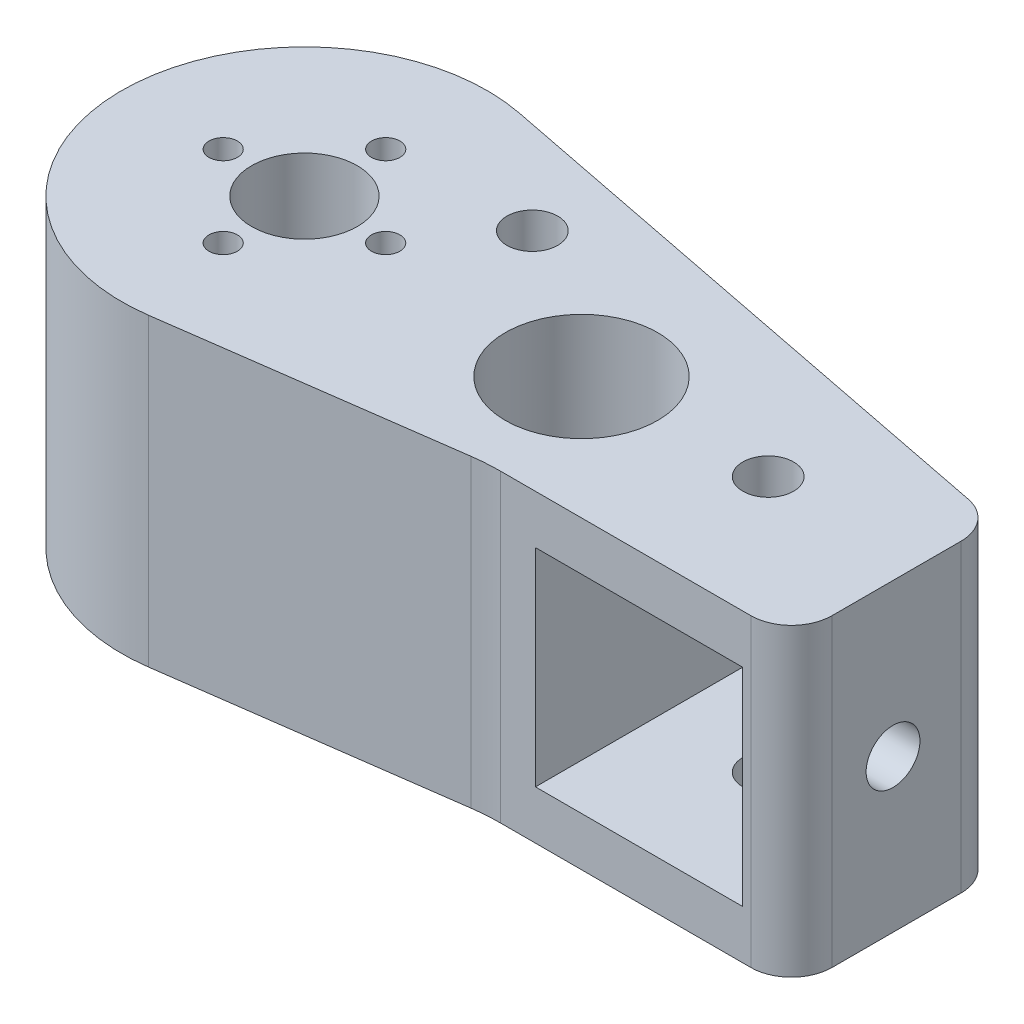
ISO-10303-21;
HEADER;
FILE_DESCRIPTION(('STEP AP214'),'2;1');
FILE_NAME('part.step','',(''),(''),'','','');
FILE_SCHEMA(('AUTOMOTIVE_DESIGN { 1 0 10303 214 1 1 1 1 }'));
ENDSEC;
DATA;
#1=APPLICATION_CONTEXT('core data for automotive mechanical design processes');
#2=APPLICATION_PROTOCOL_DEFINITION('international standard','automotive_design',2000,#1);
#3=PRODUCT_CONTEXT('',#1,'mechanical');
#4=PRODUCT('Part','Part','',(#3));
#5=PRODUCT_RELATED_PRODUCT_CATEGORY('part','',(#4));
#6=PRODUCT_DEFINITION_FORMATION('','',#4);
#7=PRODUCT_DEFINITION_CONTEXT('part definition',#1,'design');
#8=PRODUCT_DEFINITION('design','',#6,#7);
#9=PRODUCT_DEFINITION_SHAPE('','',#8);
#10=(LENGTH_UNIT() NAMED_UNIT(*) SI_UNIT(.MILLI.,.METRE.));
#11=(NAMED_UNIT(*) PLANE_ANGLE_UNIT() SI_UNIT($,.RADIAN.));
#12=(NAMED_UNIT(*) SI_UNIT($,.STERADIAN.) SOLID_ANGLE_UNIT());
#13=UNCERTAINTY_MEASURE_WITH_UNIT(LENGTH_MEASURE(1.E-05),#10,'distance_accuracy_value','');
#14=(GEOMETRIC_REPRESENTATION_CONTEXT(3) GLOBAL_UNCERTAINTY_ASSIGNED_CONTEXT((#13)) GLOBAL_UNIT_ASSIGNED_CONTEXT((#10,
#11,#12)) REPRESENTATION_CONTEXT('',''));
#15=CARTESIAN_POINT('',(0.,0.,0.));
#16=DIRECTION('',(0.,0.,1.));
#17=DIRECTION('',(1.,0.,0.));
#18=AXIS2_PLACEMENT_3D('',#15,#16,#17);
#19=CARTESIAN_POINT('',(2.45142583217951,0.,-12.4673890264279));
#20=DIRECTION('',(-0.192932807900445,0.,0.981211970797161));
#21=DIRECTION('',(0.981211970797162,0.,0.192932807900445));
#22=AXIS2_PLACEMENT_3D('',#19,#20,#21);
#23=PLANE('',#22);
#24=DIRECTION('',(0.981211970797162,0.,0.192932807900445));
#25=VECTOR('',#24,1.);
#26=CARTESIAN_POINT('',(2.45142583217951,30.,-12.4673890264279));
#27=LINE('',#26,#25);
#28=CARTESIAN_POINT('',(-43.2662184669635,30.,-21.4567142158276));
#29=VERTEX_POINT('',#28);
#30=CARTESIAN_POINT('',(11.7717312316018,30.,-10.6347649403812));
#31=VERTEX_POINT('',#30);
#32=EDGE_CURVE('E281',#29,#31,#27,.T.);
#33=ORIENTED_EDGE('',*,*,#32,.T.);
#34=DIRECTION('',(0.,-1.,0.));
#35=VECTOR('',#34,1.);
#36=CARTESIAN_POINT('',(11.7717312316018,0.,-10.6347649403812));
#37=LINE('',#36,#35);
#38=CARTESIAN_POINT('',(11.7717312316018,0.,-10.6347649403812));
#39=VERTEX_POINT('',#38);
#40=EDGE_CURVE('E346',#31,#39,#37,.T.);
#41=ORIENTED_EDGE('',*,*,#40,.T.);
#42=DIRECTION('',(0.981211970797162,0.,0.192932807900445));
#43=VECTOR('',#42,1.);
#44=CARTESIAN_POINT('',(2.45142583217951,0.,-12.4673890264279));
#45=LINE('',#44,#43);
#46=CARTESIAN_POINT('',(-43.2662184669635,0.,-21.4567142158276));
#47=VERTEX_POINT('',#46);
#48=EDGE_CURVE('E254',#47,#39,#45,.T.);
#49=ORIENTED_EDGE('',*,*,#48,.F.);
#50=DIRECTION('',(0.,1.,0.));
#51=VECTOR('',#50,1.);
#52=CARTESIAN_POINT('',(-43.2662184669635,0.,-21.4567142158276));
#53=LINE('',#52,#51);
#54=EDGE_CURVE('E278',#47,#29,#53,.T.);
#55=ORIENTED_EDGE('',*,*,#54,.T.);
#56=EDGE_LOOP('',(#33,#41,#49,#55));
#57=FACE_BOUND('',#56,.T.);
#58=DIRECTION('',(0.981211970797162,0.,0.192932807900445));
#59=VECTOR('',#58,1.);
#60=CARTESIAN_POINT('',(2.45142583217951,4.8,-12.4673890264279));
#61=LINE('',#60,#59);
#62=CARTESIAN_POINT('',(-10.2,4.8,-14.9550014714367));
#63=VERTEX_POINT('',#62);
#64=CARTESIAN_POINT('',(10.2,4.8,-10.9438098040832));
#65=VERTEX_POINT('',#64);
#66=EDGE_CURVE('E321',#63,#65,#61,.T.);
#67=ORIENTED_EDGE('',*,*,#66,.T.);
#68=DIRECTION('',(0.,1.,0.));
#69=VECTOR('',#68,1.);
#70=CARTESIAN_POINT('',(10.2,0.,-10.9438098040832));
#71=LINE('',#70,#69);
#72=CARTESIAN_POINT('',(10.2,25.2,-10.9438098040832));
#73=VERTEX_POINT('',#72);
#74=EDGE_CURVE('E324',#65,#73,#71,.T.);
#75=ORIENTED_EDGE('',*,*,#74,.T.);
#76=DIRECTION('',(-0.981211970797162,0.,-0.192932807900445));
#77=VECTOR('',#76,1.);
#78=CARTESIAN_POINT('',(2.45142583217951,25.2,-12.4673890264279));
#79=LINE('',#78,#77);
#80=CARTESIAN_POINT('',(-10.2,25.2,-14.9550014714367));
#81=VERTEX_POINT('',#80);
#82=EDGE_CURVE('E313',#73,#81,#79,.T.);
#83=ORIENTED_EDGE('',*,*,#82,.T.);
#84=DIRECTION('',(0.,-1.,0.));
#85=VECTOR('',#84,1.);
#86=CARTESIAN_POINT('',(-10.2,0.,-14.9550014714367));
#87=LINE('',#86,#85);
#88=EDGE_CURVE('E318',#81,#63,#87,.T.);
#89=ORIENTED_EDGE('',*,*,#88,.T.);
#90=EDGE_LOOP('',(#67,#75,#83,#89));
#91=FACE_BOUND('',#90,.T.);
#92=DIRECTION('',(-0.981211970797162,0.,-0.192932807900445));
#93=VECTOR('',#92,1.);
#94=CARTESIAN_POINT('',(2.45142583217951,14.,-12.4673890264279));
#95=LINE('',#94,#93);
#96=CARTESIAN_POINT('',(-26.4156936034125,14.,-18.1434453470428));
#97=VERTEX_POINT('',#96);
#98=CARTESIAN_POINT('',(-40.7928434485683,14.,-20.9703818009243));
#99=VERTEX_POINT('',#98);
#100=EDGE_CURVE('E169',#97,#99,#95,.T.);
#101=ORIENTED_EDGE('',*,*,#100,.F.);
#102=DIRECTION('',(0.,1.,0.));
#103=VECTOR('',#102,1.);
#104=CARTESIAN_POINT('',(-26.4156936034125,0.,-18.1434453470428));
#105=LINE('',#104,#103);
#106=CARTESIAN_POINT('',(-26.4156936034125,20.,-18.1434453470428));
#107=VERTEX_POINT('',#106);
#108=EDGE_CURVE('E334',#97,#107,#105,.T.);
#109=ORIENTED_EDGE('',*,*,#108,.T.);
#110=DIRECTION('',(-0.981211970797162,0.,-0.192932807900445));
#111=VECTOR('',#110,1.);
#112=CARTESIAN_POINT('',(2.45142583217951,20.,-12.4673890264279));
#113=LINE('',#112,#111);
#114=CARTESIAN_POINT('',(-40.7928434485683,20.,-20.9703818009243));
#115=VERTEX_POINT('',#114);
#116=EDGE_CURVE('E206',#107,#115,#113,.T.);
#117=ORIENTED_EDGE('',*,*,#116,.T.);
#118=DIRECTION('',(0.,-1.,0.));
#119=VECTOR('',#118,1.);
#120=CARTESIAN_POINT('',(-40.7928434485683,0.,-20.9703818009243));
#121=LINE('',#120,#119);
#122=EDGE_CURVE('E330',#115,#99,#121,.T.);
#123=ORIENTED_EDGE('',*,*,#122,.T.);
#124=EDGE_LOOP('',(#101,#109,#117,#123));
#125=FACE_BOUND('',#124,.T.);
#126=ADVANCED_FACE('F39',(#57,#91,#125),#23,.F.);
#127=CARTESIAN_POINT('',(-32.5711244596008,0.,-12.0623972205181));
#128=DIRECTION('',(0.,1.,0.));
#129=DIRECTION('',(0.,0.,1.));
#130=AXIS2_PLACEMENT_3D('',#127,#128,#129);
#131=CYLINDRICAL_SURFACE('',#130,2.5);
#132=CARTESIAN_POINT('',(-32.5711244596008,0.,-12.0623972205181));
#133=DIRECTION('',(0.,1.,0.));
#134=DIRECTION('',(0.,0.,1.));
#135=AXIS2_PLACEMENT_3D('',#132,#133,#134);
#136=CIRCLE('',#135,2.5);
#137=CARTESIAN_POINT('',(-32.5711244596008,0.,-9.56239722051805));
#138=VERTEX_POINT('',#137);
#139=EDGE_CURVE('E212',#138,#138,#136,.T.);
#140=ORIENTED_EDGE('',*,*,#139,.F.);
#141=EDGE_LOOP('',(#140));
#142=FACE_BOUND('',#141,.T.);
#143=CARTESIAN_POINT('',(-32.5711244596008,14.,-12.0623972205181));
#144=DIRECTION('',(0.,1.,0.));
#145=DIRECTION('',(0.,0.,1.));
#146=AXIS2_PLACEMENT_3D('',#143,#144,#145);
#147=CIRCLE('',#146,2.5);
#148=CARTESIAN_POINT('',(-32.5711244596008,14.,-9.56239722051805));
#149=VERTEX_POINT('',#148);
#150=EDGE_CURVE('E203',#149,#149,#147,.F.);
#151=ORIENTED_EDGE('',*,*,#150,.F.);
#152=EDGE_LOOP('',(#151));
#153=FACE_BOUND('',#152,.T.);
#154=ADVANCED_FACE('F409',(#142,#153),#131,.F.);
#155=CARTESIAN_POINT('',(-17.7223485107761,0.,-2.05322899067661));
#156=DIRECTION('',(0.,1.,0.));
#157=DIRECTION('',(0.,0.,1.));
#158=AXIS2_PLACEMENT_3D('',#155,#156,#157);
#159=CYLINDRICAL_SURFACE('',#158,7.5);
#160=CARTESIAN_POINT('',(-17.7223485107761,30.,-2.05322899067661));
#161=DIRECTION('',(0.,1.,0.));
#162=DIRECTION('',(0.,0.,1.));
#163=AXIS2_PLACEMENT_3D('',#160,#161,#162);
#164=CIRCLE('',#163,7.5);
#165=CARTESIAN_POINT('',(-17.7223485107761,30.,5.44677100932339));
#166=VERTEX_POINT('',#165);
#167=EDGE_CURVE('E247',#166,#166,#164,.T.);
#168=ORIENTED_EDGE('',*,*,#167,.T.);
#169=EDGE_LOOP('',(#168));
#170=FACE_BOUND('',#169,.T.);
#171=CARTESIAN_POINT('',(-17.7223485107761,4.,-2.05322899067661));
#172=DIRECTION('',(0.,-1.,0.));
#173=DIRECTION('',(0.,0.,-1.));
#174=AXIS2_PLACEMENT_3D('',#171,#172,#173);
#175=CIRCLE('',#174,7.5);
#176=CARTESIAN_POINT('',(-17.7223485107761,4.,-9.55322899067661));
#177=VERTEX_POINT('',#176);
#178=EDGE_CURVE('E327',#177,#177,#175,.F.);
#179=ORIENTED_EDGE('',*,*,#178,.F.);
#180=EDGE_LOOP('',(#179));
#181=FACE_BOUND('',#180,.T.);
#182=ADVANCED_FACE('F413',(#170,#181),#159,.F.);
#183=CARTESIAN_POINT('',(15.,30.,-10.));
#184=DIRECTION('',(-1.,0.,0.));
#185=DIRECTION('',(0.,0.,1.));
#186=AXIS2_PLACEMENT_3D('',#183,#184,#185);
#187=PLANE('',#186);
#188=CARTESIAN_POINT('',(15.,15.,0.));
#189=DIRECTION('',(1.,0.,0.));
#190=DIRECTION('',(0.,0.,-1.));
#191=AXIS2_PLACEMENT_3D('',#188,#189,#190);
#192=CIRCLE('',#191,2.65);
#193=CARTESIAN_POINT('',(15.,15.,-2.65));
#194=VERTEX_POINT('',#193);
#195=EDGE_CURVE('E349',#194,#194,#192,.T.);
#196=ORIENTED_EDGE('',*,*,#195,.F.);
#197=EDGE_LOOP('',(#196));
#198=FACE_BOUND('',#197,.T.);
#199=DIRECTION('',(0.,0.,-1.));
#200=VECTOR('',#199,1.);
#201=CARTESIAN_POINT('',(15.,0.,-10.));
#202=LINE('',#201,#200);
#203=CARTESIAN_POINT('',(15.,0.,6.));
#204=VERTEX_POINT('',#203);
#205=CARTESIAN_POINT('',(15.,0.,-6.70991705719255));
#206=VERTEX_POINT('',#205);
#207=EDGE_CURVE('E306',#204,#206,#202,.T.);
#208=ORIENTED_EDGE('',*,*,#207,.T.);
#209=DIRECTION('',(0.,-1.,0.));
#210=VECTOR('',#209,1.);
#211=CARTESIAN_POINT('',(15.,30.,-6.70991705719255));
#212=LINE('',#211,#210);
#213=CARTESIAN_POINT('',(15.,30.,-6.70991705719255));
#214=VERTEX_POINT('',#213);
#215=EDGE_CURVE('E60',#206,#214,#212,.F.);
#216=ORIENTED_EDGE('',*,*,#215,.T.);
#217=DIRECTION('',(0.,0.,-1.));
#218=VECTOR('',#217,1.);
#219=CARTESIAN_POINT('',(15.,30.,-10.));
#220=LINE('',#219,#218);
#221=CARTESIAN_POINT('',(15.,30.,6.));
#222=VERTEX_POINT('',#221);
#223=EDGE_CURVE('E308',#222,#214,#220,.T.);
#224=ORIENTED_EDGE('',*,*,#223,.F.);
#225=DIRECTION('',(0.,-1.,0.));
#226=VECTOR('',#225,1.);
#227=CARTESIAN_POINT('',(15.,30.,6.));
#228=LINE('',#227,#226);
#229=EDGE_CURVE('E356',#222,#204,#228,.T.);
#230=ORIENTED_EDGE('',*,*,#229,.T.);
#231=EDGE_LOOP('',(#208,#216,#224,#230));
#232=FACE_BOUND('',#231,.T.);
#233=ADVANCED_FACE('F378',(#198,#232),#187,.F.);
#234=CARTESIAN_POINT('',(-15.,30.,10.));
#235=DIRECTION('',(0.,0.,-1.));
#236=DIRECTION('',(-1.,0.,0.));
#237=AXIS2_PLACEMENT_3D('',#234,#235,#236);
#238=PLANE('',#237);
#239=DIRECTION('',(-1.,0.,0.));
#240=VECTOR('',#239,1.);
#241=CARTESIAN_POINT('',(-10.2,25.2,10.));
#242=LINE('',#241,#240);
#243=CARTESIAN_POINT('',(10.2,25.2,10.));
#244=VERTEX_POINT('',#243);
#245=CARTESIAN_POINT('',(-10.2,25.2,10.));
#246=VERTEX_POINT('',#245);
#247=EDGE_CURVE('E235',#244,#246,#242,.T.);
#248=ORIENTED_EDGE('',*,*,#247,.F.);
#249=DIRECTION('',(0.,1.,0.));
#250=VECTOR('',#249,1.);
#251=CARTESIAN_POINT('',(10.2,4.8,10.));
#252=LINE('',#251,#250);
#253=CARTESIAN_POINT('',(10.2,4.8,10.));
#254=VERTEX_POINT('',#253);
#255=EDGE_CURVE('E231',#254,#244,#252,.T.);
#256=ORIENTED_EDGE('',*,*,#255,.F.);
#257=DIRECTION('',(1.,0.,0.));
#258=VECTOR('',#257,1.);
#259=CARTESIAN_POINT('',(-10.2,4.8,10.));
#260=LINE('',#259,#258);
#261=CARTESIAN_POINT('',(-10.2,4.8,10.));
#262=VERTEX_POINT('',#261);
#263=EDGE_CURVE('E241',#262,#254,#260,.T.);
#264=ORIENTED_EDGE('',*,*,#263,.F.);
#265=DIRECTION('',(0.,-1.,0.));
#266=VECTOR('',#265,1.);
#267=CARTESIAN_POINT('',(-10.2,4.8,10.));
#268=LINE('',#267,#266);
#269=EDGE_CURVE('E238',#246,#262,#268,.T.);
#270=ORIENTED_EDGE('',*,*,#269,.F.);
#271=EDGE_LOOP('',(#248,#256,#264,#270));
#272=FACE_BOUND('',#271,.T.);
#273=DIRECTION('',(1.,0.,0.));
#274=VECTOR('',#273,1.);
#275=CARTESIAN_POINT('',(-15.,0.,10.));
#276=LINE('',#275,#274);
#277=CARTESIAN_POINT('',(-13.6279544134037,0.,10.));
#278=VERTEX_POINT('',#277);
#279=CARTESIAN_POINT('',(11.,0.,10.));
#280=VERTEX_POINT('',#279);
#281=EDGE_CURVE('E311',#278,#280,#276,.T.);
#282=ORIENTED_EDGE('',*,*,#281,.T.);
#283=DIRECTION('',(0.,-1.,0.));
#284=VECTOR('',#283,1.);
#285=CARTESIAN_POINT('',(11.,30.,10.));
#286=LINE('',#285,#284);
#287=CARTESIAN_POINT('',(11.,30.,10.));
#288=VERTEX_POINT('',#287);
#289=EDGE_CURVE('E11',#280,#288,#286,.F.);
#290=ORIENTED_EDGE('',*,*,#289,.T.);
#291=DIRECTION('',(1.,0.,0.));
#292=VECTOR('',#291,1.);
#293=CARTESIAN_POINT('',(-15.,30.,10.));
#294=LINE('',#293,#292);
#295=CARTESIAN_POINT('',(-13.6279544134037,30.,10.));
#296=VERTEX_POINT('',#295);
#297=EDGE_CURVE('E310',#296,#288,#294,.T.);
#298=ORIENTED_EDGE('',*,*,#297,.F.);
#299=DIRECTION('',(0.,-1.,0.));
#300=VECTOR('',#299,1.);
#301=CARTESIAN_POINT('',(-13.6279544134037,0.,10.));
#302=LINE('',#301,#300);
#303=EDGE_CURVE('E337',#296,#278,#302,.T.);
#304=ORIENTED_EDGE('',*,*,#303,.T.);
#305=EDGE_LOOP('',(#282,#290,#298,#304));
#306=FACE_BOUND('',#305,.T.);
#307=ADVANCED_FACE('F383',(#272,#306),#238,.F.);
#308=CARTESIAN_POINT('',(0.,30.,0.));
#309=DIRECTION('',(0.,1.,0.));
#310=DIRECTION('',(0.,0.,1.));
#311=AXIS2_PLACEMENT_3D('',#308,#309,#310);
#312=PLANE('',#311);
#313=CARTESIAN_POINT('',(-32.5711244596008,30.,-12.0623972205181));
#314=DIRECTION('',(0.,1.,0.));
#315=DIRECTION('',(0.,0.,1.));
#316=AXIS2_PLACEMENT_3D('',#313,#314,#315);
#317=CIRCLE('',#316,2.5);
#318=CARTESIAN_POINT('',(-32.5711244596008,30.,-9.56239722051805));
#319=VERTEX_POINT('',#318);
#320=EDGE_CURVE('E216',#319,#319,#317,.T.);
#321=ORIENTED_EDGE('',*,*,#320,.F.);
#322=EDGE_LOOP('',(#321));
#323=FACE_BOUND('',#322,.T.);
#324=CARTESIAN_POINT('',(0.,30.,-2.71109291847438));
#325=DIRECTION('',(0.,1.,0.));
#326=DIRECTION('',(0.,0.,1.));
#327=AXIS2_PLACEMENT_3D('',#324,#325,#326);
#328=CIRCLE('',#327,2.5);
#329=CARTESIAN_POINT('',(0.,30.,-0.211092918474376));
#330=VERTEX_POINT('',#329);
#331=EDGE_CURVE('E211',#330,#330,#328,.T.);
#332=ORIENTED_EDGE('',*,*,#331,.F.);
#333=EDGE_LOOP('',(#332));
#334=FACE_BOUND('',#333,.T.);
#335=ORIENTED_EDGE('',*,*,#167,.F.);
#336=EDGE_LOOP('',(#335));
#337=FACE_BOUND('',#336,.T.);
#338=ORIENTED_EDGE('',*,*,#223,.T.);
#339=CARTESIAN_POINT('',(11.,30.,-6.70991705719255));
#340=DIRECTION('',(0.,1.,0.));
#341=DIRECTION('',(0.,0.,1.));
#342=AXIS2_PLACEMENT_3D('',#339,#340,#341);
#343=CIRCLE('',#342,4.);
#344=EDGE_CURVE('E47',#214,#31,#343,.T.);
#345=ORIENTED_EDGE('',*,*,#344,.T.);
#346=ORIENTED_EDGE('',*,*,#32,.F.);
#347=CARTESIAN_POINT('',(-46.7390090091715,30.,-3.79489874147867));
#348=DIRECTION('',(0.,1.,0.));
#349=DIRECTION('',(0.,0.,1.));
#350=AXIS2_PLACEMENT_3D('',#347,#348,#349);
#351=CIRCLE('',#350,18.);
#352=CARTESIAN_POINT('',(-44.2808955058442,30.,14.0364690693417));
#353=VERTEX_POINT('',#352);
#354=EDGE_CURVE('E284',#29,#353,#351,.T.);
#355=ORIENTED_EDGE('',*,*,#354,.T.);
#356=DIRECTION('',(-0.990631545045575,0.,0.136561861295961));
#357=VECTOR('',#356,1.);
#358=CARTESIAN_POINT('',(1.07308774708991,30.,7.78427126564508));
#359=LINE('',#358,#357);
#360=CARTESIAN_POINT('',(-16.3591916393229,30.,10.1873690990885));
#361=VERTEX_POINT('',#360);
#362=EDGE_CURVE('E287',#361,#353,#359,.T.);
#363=ORIENTED_EDGE('',*,*,#362,.F.);
#364=CARTESIAN_POINT('',(-13.6279544134037,30.,30.));
#365=DIRECTION('',(0.,1.,0.));
#366=DIRECTION('',(0.,0.,1.));
#367=AXIS2_PLACEMENT_3D('',#364,#365,#366);
#368=CIRCLE('',#367,20.);
#369=EDGE_CURVE('E344',#361,#296,#368,.F.);
#370=ORIENTED_EDGE('',*,*,#369,.T.);
#371=ORIENTED_EDGE('',*,*,#297,.T.);
#372=CARTESIAN_POINT('',(11.,30.,6.));
#373=DIRECTION('',(0.,1.,0.));
#374=DIRECTION('',(0.,0.,1.));
#375=AXIS2_PLACEMENT_3D('',#372,#373,#374);
#376=CIRCLE('',#375,4.);
#377=EDGE_CURVE('E360',#288,#222,#376,.T.);
#378=ORIENTED_EDGE('',*,*,#377,.T.);
#379=EDGE_LOOP('',(#338,#345,#346,#355,#363,#370,#371,#378));
#380=FACE_BOUND('',#379,.T.);
#381=CARTESIAN_POINT('',(-46.7390090091715,30.,-3.79489874147867));
#382=DIRECTION('',(0.,1.,0.));
#383=DIRECTION('',(0.,0.,1.));
#384=AXIS2_PLACEMENT_3D('',#381,#382,#383);
#385=CIRCLE('',#384,5.2);
#386=CARTESIAN_POINT('',(-46.7390090091715,30.,1.40510125852133));
#387=VERTEX_POINT('',#386);
#388=EDGE_CURVE('E289',#387,#387,#385,.T.);
#389=ORIENTED_EDGE('',*,*,#388,.F.);
#390=EDGE_LOOP('',(#389));
#391=FACE_BOUND('',#390,.T.);
#392=CARTESIAN_POINT('',(-46.7390090091715,30.,4.20510125852133));
#393=DIRECTION('',(0.,1.,0.));
#394=DIRECTION('',(0.,0.,1.));
#395=AXIS2_PLACEMENT_3D('',#392,#393,#394);
#396=CIRCLE('',#395,1.4);
#397=CARTESIAN_POINT('',(-46.7390090091715,30.,5.60510125852133));
#398=VERTEX_POINT('',#397);
#399=EDGE_CURVE('E292',#398,#398,#396,.T.);
#400=ORIENTED_EDGE('',*,*,#399,.F.);
#401=EDGE_LOOP('',(#400));
#402=FACE_BOUND('',#401,.T.);
#403=CARTESIAN_POINT('',(-54.7390090091715,30.,-3.79489874147867));
#404=DIRECTION('',(0.,1.,0.));
#405=DIRECTION('',(0.,0.,1.));
#406=AXIS2_PLACEMENT_3D('',#403,#404,#405);
#407=CIRCLE('',#406,1.4);
#408=CARTESIAN_POINT('',(-54.7390090091715,30.,-2.39489874147867));
#409=VERTEX_POINT('',#408);
#410=EDGE_CURVE('E295',#409,#409,#407,.T.);
#411=ORIENTED_EDGE('',*,*,#410,.F.);
#412=EDGE_LOOP('',(#411));
#413=FACE_BOUND('',#412,.T.);
#414=CARTESIAN_POINT('',(-46.7390090091715,30.,-11.7948987414787));
#415=DIRECTION('',(0.,1.,0.));
#416=DIRECTION('',(0.,0.,1.));
#417=AXIS2_PLACEMENT_3D('',#414,#415,#416);
#418=CIRCLE('',#417,1.4);
#419=CARTESIAN_POINT('',(-46.7390090091715,30.,-10.3948987414787));
#420=VERTEX_POINT('',#419);
#421=EDGE_CURVE('E298',#420,#420,#418,.T.);
#422=ORIENTED_EDGE('',*,*,#421,.F.);
#423=EDGE_LOOP('',(#422));
#424=FACE_BOUND('',#423,.T.);
#425=CARTESIAN_POINT('',(-38.7390090091715,30.,-3.79489874147867));
#426=DIRECTION('',(0.,1.,0.));
#427=DIRECTION('',(0.,0.,1.));
#428=AXIS2_PLACEMENT_3D('',#425,#426,#427);
#429=CIRCLE('',#428,1.4);
#430=CARTESIAN_POINT('',(-38.7390090091715,30.,-2.39489874147867));
#431=VERTEX_POINT('',#430);
#432=EDGE_CURVE('E258',#431,#431,#429,.T.);
#433=ORIENTED_EDGE('',*,*,#432,.F.);
#434=EDGE_LOOP('',(#433));
#435=FACE_BOUND('',#434,.T.);
#436=ADVANCED_FACE('F364',(#323,#334,#337,#380,#391,#402,#413,#424,#435),#312,.T.);
#437=CARTESIAN_POINT('',(0.,0.,0.));
#438=DIRECTION('',(0.,1.,0.));
#439=DIRECTION('',(0.,0.,1.));
#440=AXIS2_PLACEMENT_3D('',#437,#438,#439);
#441=PLANE('',#440);
#442=ORIENTED_EDGE('',*,*,#139,.T.);
#443=EDGE_LOOP('',(#442));
#444=FACE_BOUND('',#443,.T.);
#445=CARTESIAN_POINT('',(0.,0.,-2.71109291847438));
#446=DIRECTION('',(0.,1.,0.));
#447=DIRECTION('',(0.,0.,1.));
#448=AXIS2_PLACEMENT_3D('',#445,#446,#447);
#449=CIRCLE('',#448,2.5);
#450=CARTESIAN_POINT('',(0.,0.,-0.211092918474376));
#451=VERTEX_POINT('',#450);
#452=EDGE_CURVE('E219',#451,#451,#449,.T.);
#453=ORIENTED_EDGE('',*,*,#452,.T.);
#454=EDGE_LOOP('',(#453));
#455=FACE_BOUND('',#454,.T.);
#456=ORIENTED_EDGE('',*,*,#48,.T.);
#457=CARTESIAN_POINT('',(11.,0.,-6.70991705719255));
#458=DIRECTION('',(0.,1.,0.));
#459=DIRECTION('',(0.,0.,1.));
#460=AXIS2_PLACEMENT_3D('',#457,#458,#459);
#461=CIRCLE('',#460,4.);
#462=EDGE_CURVE('E354',#39,#206,#461,.F.);
#463=ORIENTED_EDGE('',*,*,#462,.T.);
#464=ORIENTED_EDGE('',*,*,#207,.F.);
#465=CARTESIAN_POINT('',(11.,0.,6.));
#466=DIRECTION('',(0.,1.,0.));
#467=DIRECTION('',(0.,0.,1.));
#468=AXIS2_PLACEMENT_3D('',#465,#466,#467);
#469=CIRCLE('',#468,4.);
#470=EDGE_CURVE('E352',#204,#280,#469,.F.);
#471=ORIENTED_EDGE('',*,*,#470,.T.);
#472=ORIENTED_EDGE('',*,*,#281,.F.);
#473=CARTESIAN_POINT('',(-13.6279544134037,0.,30.));
#474=DIRECTION('',(0.,1.,0.));
#475=DIRECTION('',(0.,0.,1.));
#476=AXIS2_PLACEMENT_3D('',#473,#474,#475);
#477=CIRCLE('',#476,20.);
#478=CARTESIAN_POINT('',(-16.3591916393229,0.,10.1873690990885));
#479=VERTEX_POINT('',#478);
#480=EDGE_CURVE('E342',#278,#479,#477,.T.);
#481=ORIENTED_EDGE('',*,*,#480,.T.);
#482=DIRECTION('',(-0.990631545045575,0.,0.136561861295961));
#483=VECTOR('',#482,1.);
#484=CARTESIAN_POINT('',(1.07308774708991,0.,7.78427126564508));
#485=LINE('',#484,#483);
#486=CARTESIAN_POINT('',(-44.2808955058442,0.,14.0364690693417));
#487=VERTEX_POINT('',#486);
#488=EDGE_CURVE('E261',#479,#487,#485,.T.);
#489=ORIENTED_EDGE('',*,*,#488,.T.);
#490=CARTESIAN_POINT('',(-46.7390090091715,0.,-3.79489874147867));
#491=DIRECTION('',(0.,1.,0.));
#492=DIRECTION('',(0.,0.,1.));
#493=AXIS2_PLACEMENT_3D('',#490,#491,#492);
#494=CIRCLE('',#493,18.);
#495=EDGE_CURVE('E257',#47,#487,#494,.T.);
#496=ORIENTED_EDGE('',*,*,#495,.F.);
#497=EDGE_LOOP('',(#456,#463,#464,#471,#472,#481,#489,#496));
#498=FACE_BOUND('',#497,.T.);
#499=CARTESIAN_POINT('',(-46.7390090091715,0.,-3.79489874147867));
#500=DIRECTION('',(0.,1.,0.));
#501=DIRECTION('',(0.,0.,1.));
#502=AXIS2_PLACEMENT_3D('',#499,#500,#501);
#503=CIRCLE('',#502,5.2);
#504=CARTESIAN_POINT('',(-46.7390090091715,0.,1.40510125852133));
#505=VERTEX_POINT('',#504);
#506=EDGE_CURVE('E263',#505,#505,#503,.T.);
#507=ORIENTED_EDGE('',*,*,#506,.T.);
#508=EDGE_LOOP('',(#507));
#509=FACE_BOUND('',#508,.T.);
#510=CARTESIAN_POINT('',(-46.7390090091715,0.,4.20510125852133));
#511=DIRECTION('',(0.,1.,0.));
#512=DIRECTION('',(0.,0.,1.));
#513=AXIS2_PLACEMENT_3D('',#510,#511,#512);
#514=CIRCLE('',#513,1.4);
#515=CARTESIAN_POINT('',(-46.7390090091715,0.,5.60510125852133));
#516=VERTEX_POINT('',#515);
#517=EDGE_CURVE('E266',#516,#516,#514,.T.);
#518=ORIENTED_EDGE('',*,*,#517,.T.);
#519=EDGE_LOOP('',(#518));
#520=FACE_BOUND('',#519,.T.);
#521=CARTESIAN_POINT('',(-54.7390090091715,0.,-3.79489874147867));
#522=DIRECTION('',(0.,1.,0.));
#523=DIRECTION('',(0.,0.,1.));
#524=AXIS2_PLACEMENT_3D('',#521,#522,#523);
#525=CIRCLE('',#524,1.4);
#526=CARTESIAN_POINT('',(-54.7390090091715,0.,-2.39489874147867));
#527=VERTEX_POINT('',#526);
#528=EDGE_CURVE('E269',#527,#527,#525,.T.);
#529=ORIENTED_EDGE('',*,*,#528,.T.);
#530=EDGE_LOOP('',(#529));
#531=FACE_BOUND('',#530,.T.);
#532=CARTESIAN_POINT('',(-46.7390090091715,0.,-11.7948987414787));
#533=DIRECTION('',(0.,1.,0.));
#534=DIRECTION('',(0.,0.,1.));
#535=AXIS2_PLACEMENT_3D('',#532,#533,#534);
#536=CIRCLE('',#535,1.4);
#537=CARTESIAN_POINT('',(-46.7390090091715,0.,-10.3948987414787));
#538=VERTEX_POINT('',#537);
#539=EDGE_CURVE('E272',#538,#538,#536,.T.);
#540=ORIENTED_EDGE('',*,*,#539,.T.);
#541=EDGE_LOOP('',(#540));
#542=FACE_BOUND('',#541,.T.);
#543=CARTESIAN_POINT('',(-38.7390090091715,0.,-3.79489874147867));
#544=DIRECTION('',(0.,1.,0.));
#545=DIRECTION('',(0.,0.,1.));
#546=AXIS2_PLACEMENT_3D('',#543,#544,#545);
#547=CIRCLE('',#546,1.4);
#548=CARTESIAN_POINT('',(-38.7390090091715,0.,-2.39489874147867));
#549=VERTEX_POINT('',#548);
#550=EDGE_CURVE('E275',#549,#549,#547,.T.);
#551=ORIENTED_EDGE('',*,*,#550,.T.);
#552=EDGE_LOOP('',(#551));
#553=FACE_BOUND('',#552,.T.);
#554=CARTESIAN_POINT('',(-17.7223485107761,0.,-2.05322899067661));
#555=DIRECTION('',(0.,-1.,0.));
#556=DIRECTION('',(0.,0.,-1.));
#557=AXIS2_PLACEMENT_3D('',#554,#555,#556);
#558=CIRCLE('',#557,5.25);
#559=CARTESIAN_POINT('',(-17.7223485107761,0.,-7.30322899067661));
#560=VERTEX_POINT('',#559);
#561=EDGE_CURVE('E227',#560,#560,#558,.T.);
#562=ORIENTED_EDGE('',*,*,#561,.F.);
#563=EDGE_LOOP('',(#562));
#564=FACE_BOUND('',#563,.T.);
#565=ADVANCED_FACE('F375',(#444,#455,#498,#509,#520,#531,#542,#553,#564),#441,.F.);
#566=CARTESIAN_POINT('',(1.07308774708991,0.,7.78427126564508));
#567=DIRECTION('',(-0.136561861295961,0.,-0.990631545045575));
#568=DIRECTION('',(-0.990631545045575,0.,0.136561861295961));
#569=AXIS2_PLACEMENT_3D('',#566,#567,#568);
#570=PLANE('',#569);
#571=ORIENTED_EDGE('',*,*,#488,.F.);
#572=DIRECTION('',(0.,-1.,0.));
#573=VECTOR('',#572,1.);
#574=CARTESIAN_POINT('',(-16.3591916393229,30.,10.1873690990885));
#575=LINE('',#574,#573);
#576=EDGE_CURVE('E340',#479,#361,#575,.F.);
#577=ORIENTED_EDGE('',*,*,#576,.T.);
#578=ORIENTED_EDGE('',*,*,#362,.T.);
#579=DIRECTION('',(0.,1.,0.));
#580=VECTOR('',#579,1.);
#581=CARTESIAN_POINT('',(-44.2808955058442,0.,14.0364690693417));
#582=LINE('',#581,#580);
#583=EDGE_CURVE('E303',#487,#353,#582,.T.);
#584=ORIENTED_EDGE('',*,*,#583,.F.);
#585=EDGE_LOOP('',(#571,#577,#578,#584));
#586=FACE_BOUND('',#585,.T.);
#587=ADVANCED_FACE('F392',(#586),#570,.F.);
#588=CARTESIAN_POINT('',(-46.7390090091715,0.,-3.79489874147867));
#589=DIRECTION('',(0.,1.,0.));
#590=DIRECTION('',(0.,0.,1.));
#591=AXIS2_PLACEMENT_3D('',#588,#589,#590);
#592=CYLINDRICAL_SURFACE('',#591,18.);
#593=ORIENTED_EDGE('',*,*,#354,.F.);
#594=ORIENTED_EDGE('',*,*,#54,.F.);
#595=ORIENTED_EDGE('',*,*,#495,.T.);
#596=ORIENTED_EDGE('',*,*,#583,.T.);
#597=EDGE_LOOP('',(#593,#594,#595,#596));
#598=FACE_BOUND('',#597,.T.);
#599=ADVANCED_FACE('F395',(#598),#592,.T.);
#600=CARTESIAN_POINT('',(-46.7390090091715,0.,-11.7948987414787));
#601=DIRECTION('',(0.,1.,0.));
#602=DIRECTION('',(0.,0.,1.));
#603=AXIS2_PLACEMENT_3D('',#600,#601,#602);
#604=CYLINDRICAL_SURFACE('',#603,1.4);
#605=ORIENTED_EDGE('',*,*,#539,.F.);
#606=EDGE_LOOP('',(#605));
#607=FACE_BOUND('',#606,.T.);
#608=ORIENTED_EDGE('',*,*,#421,.T.);
#609=EDGE_LOOP('',(#608));
#610=FACE_BOUND('',#609,.T.);
#611=ADVANCED_FACE('F397',(#607,#610),#604,.F.);
#612=CARTESIAN_POINT('',(-54.7390090091715,0.,-3.79489874147867));
#613=DIRECTION('',(0.,1.,0.));
#614=DIRECTION('',(0.,0.,1.));
#615=AXIS2_PLACEMENT_3D('',#612,#613,#614);
#616=CYLINDRICAL_SURFACE('',#615,1.4);
#617=ORIENTED_EDGE('',*,*,#528,.F.);
#618=EDGE_LOOP('',(#617));
#619=FACE_BOUND('',#618,.T.);
#620=ORIENTED_EDGE('',*,*,#410,.T.);
#621=EDGE_LOOP('',(#620));
#622=FACE_BOUND('',#621,.T.);
#623=ADVANCED_FACE('F403',(#619,#622),#616,.F.);
#624=CARTESIAN_POINT('',(-46.7390090091715,0.,4.20510125852133));
#625=DIRECTION('',(0.,1.,0.));
#626=DIRECTION('',(0.,0.,1.));
#627=AXIS2_PLACEMENT_3D('',#624,#625,#626);
#628=CYLINDRICAL_SURFACE('',#627,1.4);
#629=ORIENTED_EDGE('',*,*,#517,.F.);
#630=EDGE_LOOP('',(#629));
#631=FACE_BOUND('',#630,.T.);
#632=ORIENTED_EDGE('',*,*,#399,.T.);
#633=EDGE_LOOP('',(#632));
#634=FACE_BOUND('',#633,.T.);
#635=ADVANCED_FACE('F504',(#631,#634),#628,.F.);
#636=CARTESIAN_POINT('',(-46.7390090091715,0.,-3.79489874147867));
#637=DIRECTION('',(0.,1.,0.));
#638=DIRECTION('',(0.,0.,1.));
#639=AXIS2_PLACEMENT_3D('',#636,#637,#638);
#640=CYLINDRICAL_SURFACE('',#639,5.2);
#641=ORIENTED_EDGE('',*,*,#506,.F.);
#642=EDGE_LOOP('',(#641));
#643=FACE_BOUND('',#642,.T.);
#644=ORIENTED_EDGE('',*,*,#388,.T.);
#645=EDGE_LOOP('',(#644));
#646=FACE_BOUND('',#645,.T.);
#647=ADVANCED_FACE('F499',(#643,#646),#640,.F.);
#648=CARTESIAN_POINT('',(-38.7390090091715,0.,-3.79489874147867));
#649=DIRECTION('',(0.,1.,0.));
#650=DIRECTION('',(0.,0.,1.));
#651=AXIS2_PLACEMENT_3D('',#648,#649,#650);
#652=CYLINDRICAL_SURFACE('',#651,1.4);
#653=ORIENTED_EDGE('',*,*,#550,.F.);
#654=EDGE_LOOP('',(#653));
#655=FACE_BOUND('',#654,.T.);
#656=ORIENTED_EDGE('',*,*,#432,.T.);
#657=EDGE_LOOP('',(#656));
#658=FACE_BOUND('',#657,.T.);
#659=ADVANCED_FACE('F496',(#655,#658),#652,.F.);
#660=CARTESIAN_POINT('',(10.2,4.8,-21.7948987414787));
#661=DIRECTION('',(1.,0.,0.));
#662=DIRECTION('',(0.,0.,-1.));
#663=AXIS2_PLACEMENT_3D('',#660,#661,#662);
#664=PLANE('',#663);
#665=CARTESIAN_POINT('',(10.2,15.,0.));
#666=DIRECTION('',(1.,0.,0.));
#667=DIRECTION('',(0.,0.,-1.));
#668=AXIS2_PLACEMENT_3D('',#665,#666,#667);
#669=CIRCLE('',#668,2.65);
#670=CARTESIAN_POINT('',(10.2,15.,-2.65));
#671=VERTEX_POINT('',#670);
#672=EDGE_CURVE('E194',#671,#671,#669,.T.);
#673=ORIENTED_EDGE('',*,*,#672,.T.);
#674=EDGE_LOOP('',(#673));
#675=FACE_BOUND('',#674,.T.);
#676=DIRECTION('',(0.,0.,1.));
#677=VECTOR('',#676,1.);
#678=CARTESIAN_POINT('',(10.2,4.8,-21.7948987414787));
#679=LINE('',#678,#677);
#680=EDGE_CURVE('E245',#65,#254,#679,.T.);
#681=ORIENTED_EDGE('',*,*,#680,.T.);
#682=ORIENTED_EDGE('',*,*,#255,.T.);
#683=DIRECTION('',(0.,0.,1.));
#684=VECTOR('',#683,1.);
#685=CARTESIAN_POINT('',(10.2,25.2,-21.7948987414787));
#686=LINE('',#685,#684);
#687=EDGE_CURVE('E244',#73,#244,#686,.T.);
#688=ORIENTED_EDGE('',*,*,#687,.F.);
#689=ORIENTED_EDGE('',*,*,#74,.F.);
#690=EDGE_LOOP('',(#681,#682,#688,#689));
#691=FACE_BOUND('',#690,.T.);
#692=ADVANCED_FACE('F486',(#675,#691),#664,.F.);
#693=CARTESIAN_POINT('',(-10.2,4.8,-21.7948987414787));
#694=DIRECTION('',(0.,-1.,0.));
#695=DIRECTION('',(0.,0.,-1.));
#696=AXIS2_PLACEMENT_3D('',#693,#694,#695);
#697=PLANE('',#696);
#698=CARTESIAN_POINT('',(0.,4.8,-2.71109291847438));
#699=DIRECTION('',(0.,-1.,0.));
#700=DIRECTION('',(0.,0.,-1.));
#701=AXIS2_PLACEMENT_3D('',#698,#699,#700);
#702=CIRCLE('',#701,2.5);
#703=CARTESIAN_POINT('',(0.,4.8,-5.21109291847438));
#704=VERTEX_POINT('',#703);
#705=EDGE_CURVE('E224',#704,#704,#702,.T.);
#706=ORIENTED_EDGE('',*,*,#705,.T.);
#707=EDGE_LOOP('',(#706));
#708=FACE_BOUND('',#707,.T.);
#709=DIRECTION('',(0.,0.,1.));
#710=VECTOR('',#709,1.);
#711=CARTESIAN_POINT('',(-10.2,4.8,-21.7948987414787));
#712=LINE('',#711,#710);
#713=EDGE_CURVE('E248',#63,#262,#712,.T.);
#714=ORIENTED_EDGE('',*,*,#713,.T.);
#715=ORIENTED_EDGE('',*,*,#263,.T.);
#716=ORIENTED_EDGE('',*,*,#680,.F.);
#717=ORIENTED_EDGE('',*,*,#66,.F.);
#718=EDGE_LOOP('',(#714,#715,#716,#717));
#719=FACE_BOUND('',#718,.T.);
#720=ADVANCED_FACE('F482',(#708,#719),#697,.F.);
#721=CARTESIAN_POINT('',(-10.2,4.8,-21.7948987414787));
#722=DIRECTION('',(-1.,0.,0.));
#723=DIRECTION('',(0.,0.,1.));
#724=AXIS2_PLACEMENT_3D('',#721,#722,#723);
#725=PLANE('',#724);
#726=DIRECTION('',(0.,0.,1.));
#727=VECTOR('',#726,1.);
#728=CARTESIAN_POINT('',(-10.2,25.2,-21.7948987414787));
#729=LINE('',#728,#727);
#730=EDGE_CURVE('E250',#81,#246,#729,.T.);
#731=ORIENTED_EDGE('',*,*,#730,.T.);
#732=ORIENTED_EDGE('',*,*,#269,.T.);
#733=ORIENTED_EDGE('',*,*,#713,.F.);
#734=ORIENTED_EDGE('',*,*,#88,.F.);
#735=EDGE_LOOP('',(#731,#732,#733,#734));
#736=FACE_BOUND('',#735,.T.);
#737=ADVANCED_FACE('F485',(#736),#725,.F.);
#738=CARTESIAN_POINT('',(-10.2,25.2,-21.7948987414787));
#739=DIRECTION('',(0.,1.,0.));
#740=DIRECTION('',(0.,0.,1.));
#741=AXIS2_PLACEMENT_3D('',#738,#739,#740);
#742=PLANE('',#741);
#743=CARTESIAN_POINT('',(0.,25.2,-2.71109291847438));
#744=DIRECTION('',(0.,1.,0.));
#745=DIRECTION('',(0.,0.,1.));
#746=AXIS2_PLACEMENT_3D('',#743,#744,#745);
#747=CIRCLE('',#746,2.5);
#748=CARTESIAN_POINT('',(0.,25.2,-0.211092918474376));
#749=VERTEX_POINT('',#748);
#750=EDGE_CURVE('E215',#749,#749,#747,.T.);
#751=ORIENTED_EDGE('',*,*,#750,.T.);
#752=EDGE_LOOP('',(#751));
#753=FACE_BOUND('',#752,.T.);
#754=ORIENTED_EDGE('',*,*,#687,.T.);
#755=ORIENTED_EDGE('',*,*,#247,.T.);
#756=ORIENTED_EDGE('',*,*,#730,.F.);
#757=ORIENTED_EDGE('',*,*,#82,.F.);
#758=EDGE_LOOP('',(#754,#755,#756,#757));
#759=FACE_BOUND('',#758,.T.);
#760=ADVANCED_FACE('F480',(#753,#759),#742,.F.);
#761=CARTESIAN_POINT('',(-17.7223485107761,4.,-2.05322899067661));
#762=DIRECTION('',(0.,-1.,0.));
#763=DIRECTION('',(0.,0.,-1.));
#764=AXIS2_PLACEMENT_3D('',#761,#762,#763);
#765=PLANE('',#764);
#766=CARTESIAN_POINT('',(-17.7223485107761,4.,-2.05322899067661));
#767=DIRECTION('',(0.,-1.,0.));
#768=DIRECTION('',(0.,0.,-1.));
#769=AXIS2_PLACEMENT_3D('',#766,#767,#768);
#770=CIRCLE('',#769,5.25);
#771=CARTESIAN_POINT('',(-17.7223485107761,4.,-7.30322899067661));
#772=VERTEX_POINT('',#771);
#773=EDGE_CURVE('E228',#772,#772,#770,.T.);
#774=ORIENTED_EDGE('',*,*,#773,.T.);
#775=EDGE_LOOP('',(#774));
#776=FACE_BOUND('',#775,.T.);
#777=ORIENTED_EDGE('',*,*,#178,.T.);
#778=EDGE_LOOP('',(#777));
#779=FACE_BOUND('',#778,.T.);
#780=ADVANCED_FACE('F476',(#776,#779),#765,.F.);
#781=CARTESIAN_POINT('',(-17.7223485107761,4.,-2.05322899067661));
#782=DIRECTION('',(0.,-1.,0.));
#783=DIRECTION('',(0.,0.,-1.));
#784=AXIS2_PLACEMENT_3D('',#781,#782,#783);
#785=CYLINDRICAL_SURFACE('',#784,5.25);
#786=ORIENTED_EDGE('',*,*,#773,.F.);
#787=EDGE_LOOP('',(#786));
#788=FACE_BOUND('',#787,.T.);
#789=ORIENTED_EDGE('',*,*,#561,.T.);
#790=EDGE_LOOP('',(#789));
#791=FACE_BOUND('',#790,.T.);
#792=ADVANCED_FACE('F473',(#788,#791),#785,.F.);
#793=CARTESIAN_POINT('',(0.,0.,-2.71109291847438));
#794=DIRECTION('',(0.,1.,0.));
#795=DIRECTION('',(0.,0.,1.));
#796=AXIS2_PLACEMENT_3D('',#793,#794,#795);
#797=CYLINDRICAL_SURFACE('',#796,2.5);
#798=ORIENTED_EDGE('',*,*,#331,.T.);
#799=EDGE_LOOP('',(#798));
#800=FACE_BOUND('',#799,.T.);
#801=ORIENTED_EDGE('',*,*,#750,.F.);
#802=EDGE_LOOP('',(#801));
#803=FACE_BOUND('',#802,.T.);
#804=ADVANCED_FACE('F471',(#800,#803),#797,.F.);
#805=ORIENTED_EDGE('',*,*,#452,.F.);
#806=EDGE_LOOP('',(#805));
#807=FACE_BOUND('',#806,.T.);
#808=ORIENTED_EDGE('',*,*,#705,.F.);
#809=EDGE_LOOP('',(#808));
#810=FACE_BOUND('',#809,.T.);
#811=ADVANCED_FACE('F467',(#807,#810),#797,.F.);
#812=CARTESIAN_POINT('',(-32.5711244596008,20.,-12.0623972205181));
#813=DIRECTION('',(0.,1.,0.));
#814=DIRECTION('',(0.,0.,1.));
#815=AXIS2_PLACEMENT_3D('',#812,#813,#814);
#816=CIRCLE('',#815,2.5);
#817=CARTESIAN_POINT('',(-32.5711244596008,20.,-9.56239722051805));
#818=VERTEX_POINT('',#817);
#819=EDGE_CURVE('E190',#818,#818,#816,.F.);
#820=ORIENTED_EDGE('',*,*,#819,.T.);
#821=EDGE_LOOP('',(#820));
#822=FACE_BOUND('',#821,.T.);
#823=ORIENTED_EDGE('',*,*,#320,.T.);
#824=EDGE_LOOP('',(#823));
#825=FACE_BOUND('',#824,.T.);
#826=ADVANCED_FACE('F416',(#822,#825),#131,.F.);
#827=CARTESIAN_POINT('',(-23.468573162326,14.,3.23522105573594));
#828=DIRECTION('',(0.990631545045575,0.,-0.13656186129596));
#829=DIRECTION('',(-0.13656186129596,0.,-0.990631545045575));
#830=AXIS2_PLACEMENT_3D('',#827,#828,#829);
#831=PLANE('',#830);
#832=DIRECTION('',(-0.13656186129596,0.,-0.990631545045575));
#833=VECTOR('',#832,1.);
#834=CARTESIAN_POINT('',(-23.468573162326,14.,3.23522105573594));
#835=LINE('',#834,#833);
#836=CARTESIAN_POINT('',(-25.1615803440193,14.,-9.04599936889885));
#837=VERTEX_POINT('',#836);
#838=EDGE_CURVE('E173',#837,#97,#835,.T.);
#839=ORIENTED_EDGE('',*,*,#838,.F.);
#840=DIRECTION('',(0.,1.,0.));
#841=VECTOR('',#840,1.);
#842=CARTESIAN_POINT('',(-25.1615803440193,14.,-9.04599936889885));
#843=LINE('',#842,#841);
#844=CARTESIAN_POINT('',(-25.1615803440193,20.,-9.04599936889885));
#845=VERTEX_POINT('',#844);
#846=EDGE_CURVE('E204',#837,#845,#843,.T.);
#847=ORIENTED_EDGE('',*,*,#846,.T.);
#848=DIRECTION('',(-0.13656186129596,0.,-0.990631545045575));
#849=VECTOR('',#848,1.);
#850=CARTESIAN_POINT('',(-23.468573162326,20.,3.23522105573594));
#851=LINE('',#850,#849);
#852=EDGE_CURVE('E193',#845,#107,#851,.T.);
#853=ORIENTED_EDGE('',*,*,#852,.T.);
#854=ORIENTED_EDGE('',*,*,#108,.F.);
#855=EDGE_LOOP('',(#839,#847,#853,#854));
#856=FACE_BOUND('',#855,.T.);
#857=ADVANCED_FACE('F462',(#856),#831,.F.);
#858=CARTESIAN_POINT('',(-37.1951665031212,14.,5.12747771286214));
#859=DIRECTION('',(-0.990631545045575,0.,0.13656186129596));
#860=DIRECTION('',(0.13656186129596,0.,0.990631545045575));
#861=AXIS2_PLACEMENT_3D('',#858,#859,#860);
#862=PLANE('',#861);
#863=DIRECTION('',(0.13656186129596,0.,0.990631545045575));
#864=VECTOR('',#863,1.);
#865=CARTESIAN_POINT('',(-37.1951665031212,20.,5.12747771286214));
#866=LINE('',#865,#864);
#867=CARTESIAN_POINT('',(-38.8881736848145,20.,-7.15374271177263));
#868=VERTEX_POINT('',#867);
#869=EDGE_CURVE('E178',#115,#868,#866,.T.);
#870=ORIENTED_EDGE('',*,*,#869,.T.);
#871=DIRECTION('',(0.,1.,0.));
#872=VECTOR('',#871,1.);
#873=CARTESIAN_POINT('',(-38.8881736848145,14.,-7.15374271177263));
#874=LINE('',#873,#872);
#875=CARTESIAN_POINT('',(-38.8881736848145,14.,-7.15374271177263));
#876=VERTEX_POINT('',#875);
#877=EDGE_CURVE('E176',#876,#868,#874,.T.);
#878=ORIENTED_EDGE('',*,*,#877,.F.);
#879=DIRECTION('',(0.13656186129596,0.,0.990631545045575));
#880=VECTOR('',#879,1.);
#881=CARTESIAN_POINT('',(-37.1951665031212,14.,5.12747771286214));
#882=LINE('',#881,#880);
#883=EDGE_CURVE('E160',#99,#876,#882,.T.);
#884=ORIENTED_EDGE('',*,*,#883,.F.);
#885=ORIENTED_EDGE('',*,*,#122,.F.);
#886=EDGE_LOOP('',(#870,#878,#884,#885));
#887=FACE_BOUND('',#886,.T.);
#888=ADVANCED_FACE('F177',(#887),#862,.F.);
#889=CARTESIAN_POINT('',(0.,14.,0.));
#890=DIRECTION('',(0.,1.,0.));
#891=DIRECTION('',(0.,0.,1.));
#892=AXIS2_PLACEMENT_3D('',#889,#890,#891);
#893=PLANE('',#892);
#894=ORIENTED_EDGE('',*,*,#150,.T.);
#895=EDGE_LOOP('',(#894));
#896=FACE_BOUND('',#895,.T.);
#897=ORIENTED_EDGE('',*,*,#100,.T.);
#898=ORIENTED_EDGE('',*,*,#883,.T.);
#899=DIRECTION('',(0.926193014447677,0.,0.377049731452399));
#900=VECTOR('',#899,1.);
#901=CARTESIAN_POINT('',(-3.03035959510668,14.,7.44384004051898));
#902=LINE('',#901,#900);
#903=CARTESIAN_POINT('',(-31.4786295692331,14.,-4.13734486015344));
#904=VERTEX_POINT('',#903);
#905=EDGE_CURVE('E165',#876,#904,#902,.T.);
#906=ORIENTED_EDGE('',*,*,#905,.T.);
#907=DIRECTION('',(0.789631153151716,0.,-0.613581813593176));
#908=VECTOR('',#907,1.);
#909=CARTESIAN_POINT('',(-13.8557149260193,14.,-17.8312067150482));
#910=LINE('',#909,#908);
#911=EDGE_CURVE('E183',#904,#837,#910,.T.);
#912=ORIENTED_EDGE('',*,*,#911,.T.);
#913=ORIENTED_EDGE('',*,*,#838,.T.);
#914=EDGE_LOOP('',(#897,#898,#906,#912,#913));
#915=FACE_BOUND('',#914,.T.);
#916=ADVANCED_FACE('F162',(#896,#915),#893,.T.);
#917=CARTESIAN_POINT('',(0.,20.,0.));
#918=DIRECTION('',(0.,1.,0.));
#919=DIRECTION('',(0.,0.,1.));
#920=AXIS2_PLACEMENT_3D('',#917,#918,#919);
#921=PLANE('',#920);
#922=ORIENTED_EDGE('',*,*,#819,.F.);
#923=EDGE_LOOP('',(#922));
#924=FACE_BOUND('',#923,.T.);
#925=ORIENTED_EDGE('',*,*,#852,.F.);
#926=DIRECTION('',(0.789631153151716,0.,-0.613581813593176));
#927=VECTOR('',#926,1.);
#928=CARTESIAN_POINT('',(-13.8557149260193,20.,-17.8312067150482));
#929=LINE('',#928,#927);
#930=CARTESIAN_POINT('',(-31.4786295692331,20.,-4.13734486015344));
#931=VERTEX_POINT('',#930);
#932=EDGE_CURVE('E200',#931,#845,#929,.T.);
#933=ORIENTED_EDGE('',*,*,#932,.F.);
#934=DIRECTION('',(0.926193014447677,0.,0.377049731452399));
#935=VECTOR('',#934,1.);
#936=CARTESIAN_POINT('',(-3.03035959510668,20.,7.44384004051898));
#937=LINE('',#936,#935);
#938=EDGE_CURVE('E198',#868,#931,#937,.T.);
#939=ORIENTED_EDGE('',*,*,#938,.F.);
#940=ORIENTED_EDGE('',*,*,#869,.F.);
#941=ORIENTED_EDGE('',*,*,#116,.F.);
#942=EDGE_LOOP('',(#925,#933,#939,#940,#941));
#943=FACE_BOUND('',#942,.T.);
#944=ADVANCED_FACE('F449',(#924,#943),#921,.F.);
#945=CARTESIAN_POINT('',(-13.8557149260193,14.,-17.8312067150482));
#946=DIRECTION('',(0.613581813593176,0.,0.789631153151716));
#947=DIRECTION('',(0.789631153151716,0.,-0.613581813593176));
#948=AXIS2_PLACEMENT_3D('',#945,#946,#947);
#949=PLANE('',#948);
#950=ORIENTED_EDGE('',*,*,#932,.T.);
#951=ORIENTED_EDGE('',*,*,#846,.F.);
#952=ORIENTED_EDGE('',*,*,#911,.F.);
#953=DIRECTION('',(0.,1.,0.));
#954=VECTOR('',#953,1.);
#955=CARTESIAN_POINT('',(-31.4786295692331,14.,-4.13734486015344));
#956=LINE('',#955,#954);
#957=EDGE_CURVE('E182',#904,#931,#956,.T.);
#958=ORIENTED_EDGE('',*,*,#957,.T.);
#959=EDGE_LOOP('',(#950,#951,#952,#958));
#960=FACE_BOUND('',#959,.T.);
#961=ADVANCED_FACE('F453',(#960),#949,.F.);
#962=CARTESIAN_POINT('',(-3.03035959510668,14.,7.44384004051898));
#963=DIRECTION('',(-0.377049731452399,0.,0.926193014447676));
#964=DIRECTION('',(0.926193014447677,0.,0.377049731452399));
#965=AXIS2_PLACEMENT_3D('',#962,#963,#964);
#966=PLANE('',#965);
#967=ORIENTED_EDGE('',*,*,#938,.T.);
#968=ORIENTED_EDGE('',*,*,#957,.F.);
#969=ORIENTED_EDGE('',*,*,#905,.F.);
#970=ORIENTED_EDGE('',*,*,#877,.T.);
#971=EDGE_LOOP('',(#967,#968,#969,#970));
#972=FACE_BOUND('',#971,.T.);
#973=ADVANCED_FACE('F185',(#972),#966,.F.);
#974=CARTESIAN_POINT('',(-13.6279544134037,30.,30.));
#975=DIRECTION('',(0.,1.,0.));
#976=DIRECTION('',(0.,0.,1.));
#977=AXIS2_PLACEMENT_3D('',#974,#975,#976);
#978=CYLINDRICAL_SURFACE('',#977,20.);
#979=ORIENTED_EDGE('',*,*,#369,.F.);
#980=ORIENTED_EDGE('',*,*,#576,.F.);
#981=ORIENTED_EDGE('',*,*,#480,.F.);
#982=ORIENTED_EDGE('',*,*,#303,.F.);
#983=EDGE_LOOP('',(#979,#980,#981,#982));
#984=FACE_BOUND('',#983,.T.);
#985=ADVANCED_FACE('F387',(#984),#978,.F.);
#986=CARTESIAN_POINT('',(-0.999999999999999,15.,0.));
#987=DIRECTION('',(1.,0.,0.));
#988=DIRECTION('',(0.,0.,-1.));
#989=AXIS2_PLACEMENT_3D('',#986,#987,#988);
#990=CYLINDRICAL_SURFACE('',#989,2.65);
#991=ORIENTED_EDGE('',*,*,#195,.T.);
#992=EDGE_LOOP('',(#991));
#993=FACE_BOUND('',#992,.T.);
#994=ORIENTED_EDGE('',*,*,#672,.F.);
#995=EDGE_LOOP('',(#994));
#996=FACE_BOUND('',#995,.T.);
#997=ADVANCED_FACE('F434',(#993,#996),#990,.F.);
#998=CARTESIAN_POINT('',(11.,0.,-6.70991705719255));
#999=DIRECTION('',(0.,-1.,0.));
#1000=DIRECTION('',(0.,0.,-1.));
#1001=AXIS2_PLACEMENT_3D('',#998,#999,#1000);
#1002=CYLINDRICAL_SURFACE('',#1001,4.);
#1003=ORIENTED_EDGE('',*,*,#344,.F.);
#1004=ORIENTED_EDGE('',*,*,#215,.F.);
#1005=ORIENTED_EDGE('',*,*,#462,.F.);
#1006=ORIENTED_EDGE('',*,*,#40,.F.);
#1007=EDGE_LOOP('',(#1003,#1004,#1005,#1006));
#1008=FACE_BOUND('',#1007,.T.);
#1009=ADVANCED_FACE('F372',(#1008),#1002,.T.);
#1010=CARTESIAN_POINT('',(11.,30.,6.));
#1011=DIRECTION('',(0.,-1.,0.));
#1012=DIRECTION('',(0.,0.,-1.));
#1013=AXIS2_PLACEMENT_3D('',#1010,#1011,#1012);
#1014=CYLINDRICAL_SURFACE('',#1013,4.);
#1015=ORIENTED_EDGE('',*,*,#377,.F.);
#1016=ORIENTED_EDGE('',*,*,#289,.F.);
#1017=ORIENTED_EDGE('',*,*,#470,.F.);
#1018=ORIENTED_EDGE('',*,*,#229,.F.);
#1019=EDGE_LOOP('',(#1015,#1016,#1017,#1018));
#1020=FACE_BOUND('',#1019,.T.);
#1021=ADVANCED_FACE('F41',(#1020),#1014,.T.);
#1022=CLOSED_SHELL('',(#126,#154,#182,#233,#307,#436,#565,#587,#599,#611,#623,#635,#647,#659,
#692,#720,#737,#760,#780,#792,#804,#811,#826,#857,#888,#916,#944,#961,#973,#985,#997,#1009,#1021));
#1023=MANIFOLD_SOLID_BREP('B2',#1022);
#1024=ADVANCED_BREP_SHAPE_REPRESENTATION('',(#18,#1023),#14);
#1025=SHAPE_DEFINITION_REPRESENTATION(#9,#1024);
ENDSEC;
END-ISO-10303-21;
